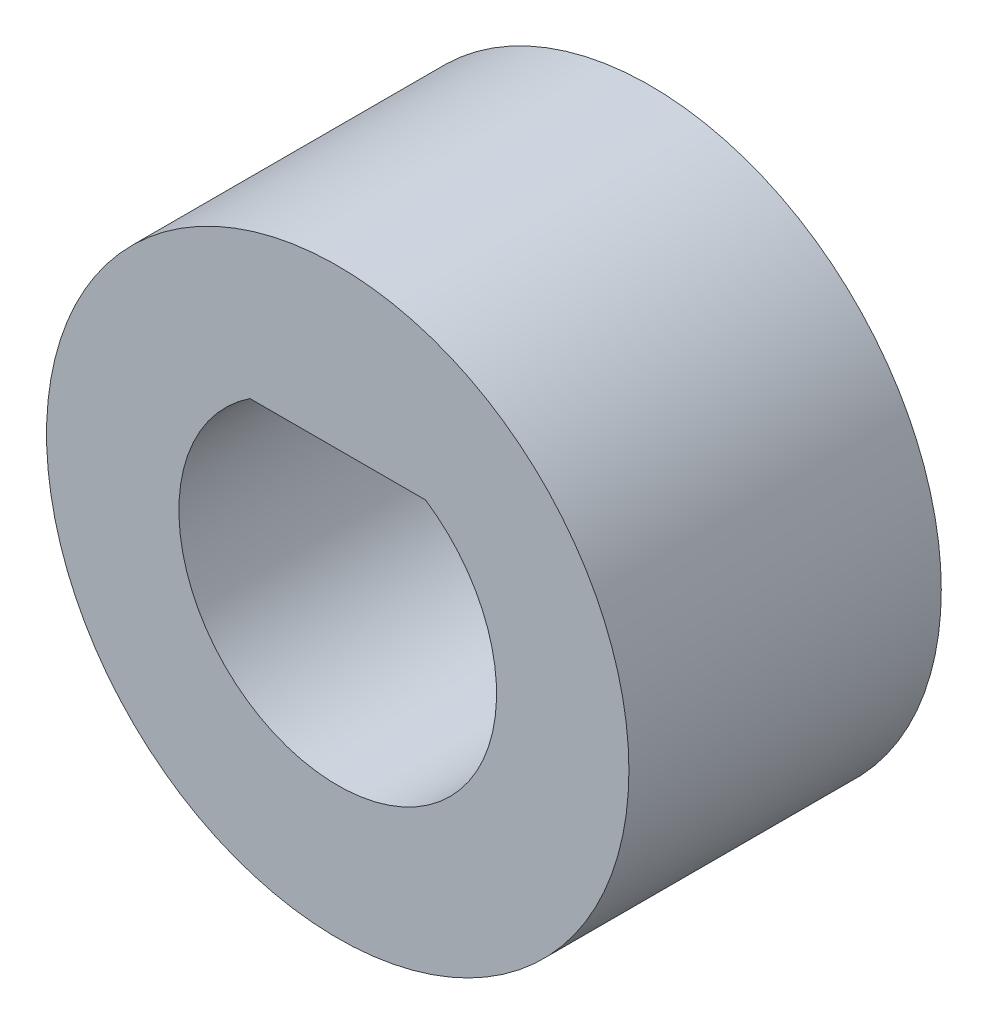
ISO-10303-21;
HEADER;
FILE_DESCRIPTION(('STEP AP214'),'2;1');
FILE_NAME('part.step','',(''),(''),'','','');
FILE_SCHEMA(('AUTOMOTIVE_DESIGN { 1 0 10303 214 1 1 1 1 }'));
ENDSEC;
DATA;
#1=APPLICATION_CONTEXT('core data for automotive mechanical design processes');
#2=APPLICATION_PROTOCOL_DEFINITION('international standard','automotive_design',2000,#1);
#3=PRODUCT_CONTEXT('',#1,'mechanical');
#4=PRODUCT('Part','Part','',(#3));
#5=PRODUCT_RELATED_PRODUCT_CATEGORY('part','',(#4));
#6=PRODUCT_DEFINITION_FORMATION('','',#4);
#7=PRODUCT_DEFINITION_CONTEXT('part definition',#1,'design');
#8=PRODUCT_DEFINITION('design','',#6,#7);
#9=PRODUCT_DEFINITION_SHAPE('','',#8);
#10=(LENGTH_UNIT() NAMED_UNIT(*) SI_UNIT(.MILLI.,.METRE.));
#11=(NAMED_UNIT(*) PLANE_ANGLE_UNIT() SI_UNIT($,.RADIAN.));
#12=(NAMED_UNIT(*) SI_UNIT($,.STERADIAN.) SOLID_ANGLE_UNIT());
#13=UNCERTAINTY_MEASURE_WITH_UNIT(LENGTH_MEASURE(1.E-05),#10,'distance_accuracy_value','');
#14=(GEOMETRIC_REPRESENTATION_CONTEXT(3) GLOBAL_UNCERTAINTY_ASSIGNED_CONTEXT((#13)) GLOBAL_UNIT_ASSIGNED_CONTEXT((#10,
#11,#12)) REPRESENTATION_CONTEXT('',''));
#15=CARTESIAN_POINT('',(0.,0.,0.));
#16=DIRECTION('',(0.,0.,1.));
#17=DIRECTION('',(1.,0.,0.));
#18=AXIS2_PLACEMENT_3D('',#15,#16,#17);
#19=CARTESIAN_POINT('',(0.,0.,2.95));
#20=DIRECTION('',(0.,0.,1.));
#21=DIRECTION('',(1.,0.,0.));
#22=AXIS2_PLACEMENT_3D('',#19,#20,#21);
#23=PLANE('',#22);
#24=CARTESIAN_POINT('',(0.,0.,2.95));
#25=DIRECTION('',(0.,0.,1.));
#26=DIRECTION('',(1.,0.,0.));
#27=AXIS2_PLACEMENT_3D('',#24,#25,#26);
#28=CIRCLE('',#27,2.75);
#29=CARTESIAN_POINT('',(2.75,0.,2.95));
#30=VERTEX_POINT('',#29);
#31=EDGE_CURVE('E11',#30,#30,#28,.T.);
#32=ORIENTED_EDGE('',*,*,#31,.T.);
#33=EDGE_LOOP('',(#32));
#34=FACE_BOUND('',#33,.T.);
#35=DIRECTION('',(-1.,0.,0.));
#36=VECTOR('',#35,1.);
#37=CARTESIAN_POINT('',(-0.829156197588851,1.25,2.95));
#38=LINE('',#37,#36);
#39=CARTESIAN_POINT('',(0.829156197588851,1.25,2.95));
#40=VERTEX_POINT('',#39);
#41=CARTESIAN_POINT('',(-0.829156197588851,1.25,2.95));
#42=VERTEX_POINT('',#41);
#43=EDGE_CURVE('E75',#40,#42,#38,.T.);
#44=ORIENTED_EDGE('',*,*,#43,.F.);
#45=CARTESIAN_POINT('',(0.,0.,2.95));
#46=DIRECTION('',(0.,0.,1.));
#47=DIRECTION('',(1.,0.,0.));
#48=AXIS2_PLACEMENT_3D('',#45,#46,#47);
#49=CIRCLE('',#48,1.5);
#50=EDGE_CURVE('E66',#42,#40,#49,.T.);
#51=ORIENTED_EDGE('',*,*,#50,.F.);
#52=EDGE_LOOP('',(#44,#51));
#53=FACE_BOUND('',#52,.T.);
#54=ADVANCED_FACE('F34',(#34,#53),#23,.T.);
#55=CARTESIAN_POINT('',(0.,0.,0.));
#56=DIRECTION('',(0.,0.,1.));
#57=DIRECTION('',(1.,0.,0.));
#58=AXIS2_PLACEMENT_3D('',#55,#56,#57);
#59=PLANE('',#58);
#60=CARTESIAN_POINT('',(0.,0.,0.));
#61=DIRECTION('',(0.,0.,1.));
#62=DIRECTION('',(1.,0.,0.));
#63=AXIS2_PLACEMENT_3D('',#60,#61,#62);
#64=CIRCLE('',#63,2.75);
#65=CARTESIAN_POINT('',(2.75,0.,0.));
#66=VERTEX_POINT('',#65);
#67=EDGE_CURVE('E38',#66,#66,#64,.T.);
#68=ORIENTED_EDGE('',*,*,#67,.F.);
#69=EDGE_LOOP('',(#68));
#70=FACE_BOUND('',#69,.T.);
#71=CARTESIAN_POINT('',(0.,0.,0.));
#72=DIRECTION('',(0.,0.,1.));
#73=DIRECTION('',(1.,0.,0.));
#74=AXIS2_PLACEMENT_3D('',#71,#72,#73);
#75=CIRCLE('',#74,1.5);
#76=CARTESIAN_POINT('',(-0.829156197588851,1.25,0.));
#77=VERTEX_POINT('',#76);
#78=CARTESIAN_POINT('',(0.829156197588851,1.25,0.));
#79=VERTEX_POINT('',#78);
#80=EDGE_CURVE('E56',#77,#79,#75,.T.);
#81=ORIENTED_EDGE('',*,*,#80,.T.);
#82=DIRECTION('',(-1.,0.,0.));
#83=VECTOR('',#82,1.);
#84=CARTESIAN_POINT('',(-0.829156197588851,1.25,0.));
#85=LINE('',#84,#83);
#86=EDGE_CURVE('E62',#79,#77,#85,.T.);
#87=ORIENTED_EDGE('',*,*,#86,.T.);
#88=EDGE_LOOP('',(#81,#87));
#89=FACE_BOUND('',#88,.T.);
#90=ADVANCED_FACE('F72',(#70,#89),#59,.F.);
#91=CARTESIAN_POINT('',(0.,0.,2.95));
#92=DIRECTION('',(0.,0.,-1.));
#93=DIRECTION('',(-1.,0.,0.));
#94=AXIS2_PLACEMENT_3D('',#91,#92,#93);
#95=CYLINDRICAL_SURFACE('',#94,2.75);
#96=ORIENTED_EDGE('',*,*,#31,.F.);
#97=EDGE_LOOP('',(#96));
#98=FACE_BOUND('',#97,.T.);
#99=ORIENTED_EDGE('',*,*,#67,.T.);
#100=EDGE_LOOP('',(#99));
#101=FACE_BOUND('',#100,.T.);
#102=ADVANCED_FACE('F36',(#98,#101),#95,.T.);
#103=CARTESIAN_POINT('',(0.,0.,2.95));
#104=DIRECTION('',(0.,0.,-1.));
#105=DIRECTION('',(-1.,0.,0.));
#106=AXIS2_PLACEMENT_3D('',#103,#104,#105);
#107=CYLINDRICAL_SURFACE('',#106,1.5);
#108=ORIENTED_EDGE('',*,*,#80,.F.);
#109=DIRECTION('',(0.,0.,-1.));
#110=VECTOR('',#109,1.);
#111=CARTESIAN_POINT('',(-0.829156197588851,1.25,2.95));
#112=LINE('',#111,#110);
#113=EDGE_CURVE('E64',#42,#77,#112,.T.);
#114=ORIENTED_EDGE('',*,*,#113,.F.);
#115=ORIENTED_EDGE('',*,*,#50,.T.);
#116=DIRECTION('',(0.,0.,-1.));
#117=VECTOR('',#116,1.);
#118=CARTESIAN_POINT('',(0.829156197588851,1.25,2.95));
#119=LINE('',#118,#117);
#120=EDGE_CURVE('E49',#40,#79,#119,.T.);
#121=ORIENTED_EDGE('',*,*,#120,.T.);
#122=EDGE_LOOP('',(#108,#114,#115,#121));
#123=FACE_BOUND('',#122,.T.);
#124=ADVANCED_FACE('F68',(#123),#107,.F.);
#125=CARTESIAN_POINT('',(-0.829156197588851,1.25,2.95));
#126=DIRECTION('',(0.,-1.,0.));
#127=DIRECTION('',(0.,0.,-1.));
#128=AXIS2_PLACEMENT_3D('',#125,#126,#127);
#129=PLANE('',#128);
#130=ORIENTED_EDGE('',*,*,#86,.F.);
#131=ORIENTED_EDGE('',*,*,#120,.F.);
#132=ORIENTED_EDGE('',*,*,#43,.T.);
#133=ORIENTED_EDGE('',*,*,#113,.T.);
#134=EDGE_LOOP('',(#130,#131,#132,#133));
#135=FACE_BOUND('',#134,.T.);
#136=ADVANCED_FACE('F63',(#135),#129,.T.);
#137=CLOSED_SHELL('',(#54,#90,#102,#124,#136));
#138=MANIFOLD_SOLID_BREP('B2',#137);
#139=ADVANCED_BREP_SHAPE_REPRESENTATION('',(#18,#138),#14);
#140=SHAPE_DEFINITION_REPRESENTATION(#9,#139);
ENDSEC;
END-ISO-10303-21;
